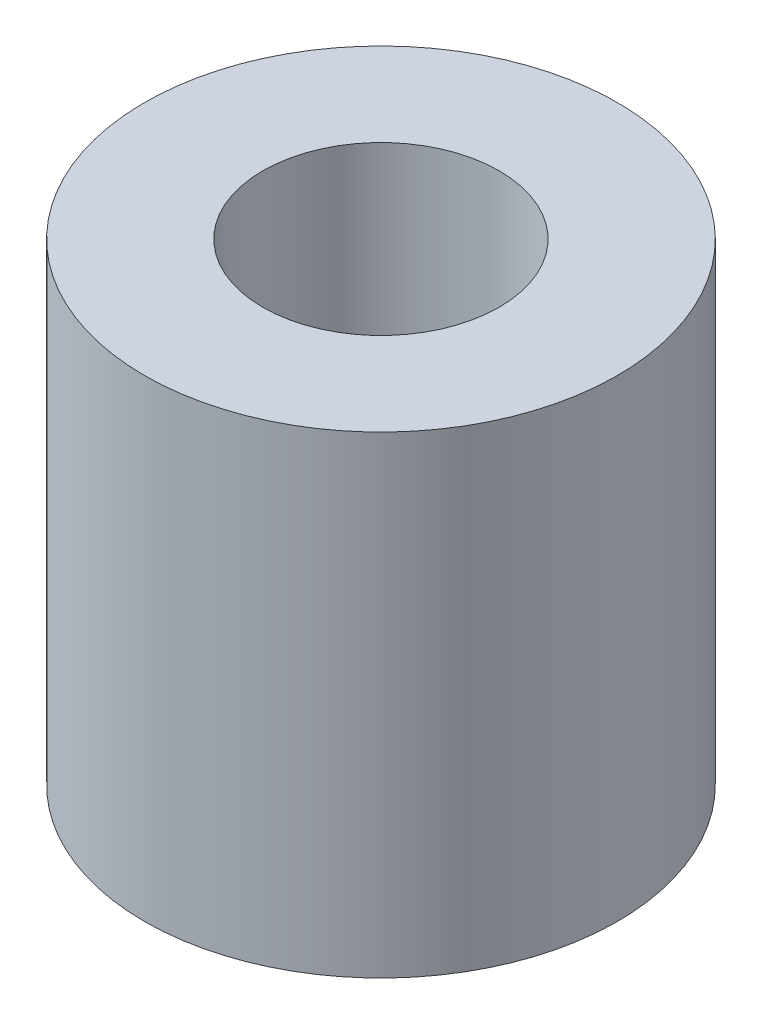
ISO-10303-21;
HEADER;
FILE_DESCRIPTION(('STEP AP214'),'2;1');
FILE_NAME('part.step','',(''),(''),'','','');
FILE_SCHEMA(('AUTOMOTIVE_DESIGN { 1 0 10303 214 1 1 1 1 }'));
ENDSEC;
DATA;
#1=APPLICATION_CONTEXT('core data for automotive mechanical design processes');
#2=APPLICATION_PROTOCOL_DEFINITION('international standard','automotive_design',2000,#1);
#3=PRODUCT_CONTEXT('',#1,'mechanical');
#4=PRODUCT('Part','Part','',(#3));
#5=PRODUCT_RELATED_PRODUCT_CATEGORY('part','',(#4));
#6=PRODUCT_DEFINITION_FORMATION('','',#4);
#7=PRODUCT_DEFINITION_CONTEXT('part definition',#1,'design');
#8=PRODUCT_DEFINITION('design','',#6,#7);
#9=PRODUCT_DEFINITION_SHAPE('','',#8);
#10=(LENGTH_UNIT() NAMED_UNIT(*) SI_UNIT(.MILLI.,.METRE.));
#11=(NAMED_UNIT(*) PLANE_ANGLE_UNIT() SI_UNIT($,.RADIAN.));
#12=(NAMED_UNIT(*) SI_UNIT($,.STERADIAN.) SOLID_ANGLE_UNIT());
#13=UNCERTAINTY_MEASURE_WITH_UNIT(LENGTH_MEASURE(1.E-05),#10,'distance_accuracy_value','');
#14=(GEOMETRIC_REPRESENTATION_CONTEXT(3) GLOBAL_UNCERTAINTY_ASSIGNED_CONTEXT((#13)) GLOBAL_UNIT_ASSIGNED_CONTEXT((#10,
#11,#12)) REPRESENTATION_CONTEXT('',''));
#15=CARTESIAN_POINT('',(0.,0.,0.));
#16=DIRECTION('',(0.,0.,1.));
#17=DIRECTION('',(1.,0.,0.));
#18=AXIS2_PLACEMENT_3D('',#15,#16,#17);
#19=CARTESIAN_POINT('',(0.,12.7,0.));
#20=DIRECTION('',(0.,1.,0.));
#21=DIRECTION('',(0.,0.,1.));
#22=AXIS2_PLACEMENT_3D('',#19,#20,#21);
#23=PLANE('',#22);
#24=CARTESIAN_POINT('',(0.,12.7,0.));
#25=DIRECTION('',(0.,1.,0.));
#26=DIRECTION('',(0.,0.,1.));
#27=AXIS2_PLACEMENT_3D('',#24,#25,#26);
#28=CIRCLE('',#27,6.34999999999999);
#29=CARTESIAN_POINT('',(0.,12.7,6.34999999999999));
#30=VERTEX_POINT('',#29);
#31=EDGE_CURVE('E10',#30,#30,#28,.T.);
#32=ORIENTED_EDGE('',*,*,#31,.T.);
#33=EDGE_LOOP('',(#32));
#34=FACE_BOUND('',#33,.T.);
#35=CARTESIAN_POINT('',(0.,12.7,0.));
#36=DIRECTION('',(0.,1.,0.));
#37=DIRECTION('',(0.,0.,1.));
#38=AXIS2_PLACEMENT_3D('',#35,#36,#37);
#39=CIRCLE('',#38,3.175);
#40=CARTESIAN_POINT('',(0.,12.7,3.175));
#41=VERTEX_POINT('',#40);
#42=EDGE_CURVE('E56',#41,#41,#39,.T.);
#43=ORIENTED_EDGE('',*,*,#42,.F.);
#44=EDGE_LOOP('',(#43));
#45=FACE_BOUND('',#44,.T.);
#46=ADVANCED_FACE('F43',(#34,#45),#23,.T.);
#47=CARTESIAN_POINT('',(0.,0.,0.));
#48=DIRECTION('',(0.,1.,0.));
#49=DIRECTION('',(0.,0.,1.));
#50=AXIS2_PLACEMENT_3D('',#47,#48,#49);
#51=PLANE('',#50);
#52=CARTESIAN_POINT('',(0.,0.,0.));
#53=DIRECTION('',(0.,1.,0.));
#54=DIRECTION('',(0.,0.,1.));
#55=AXIS2_PLACEMENT_3D('',#52,#53,#54);
#56=CIRCLE('',#55,6.34999999999999);
#57=CARTESIAN_POINT('',(0.,0.,6.34999999999999));
#58=VERTEX_POINT('',#57);
#59=EDGE_CURVE('E47',#58,#58,#56,.T.);
#60=ORIENTED_EDGE('',*,*,#59,.F.);
#61=EDGE_LOOP('',(#60));
#62=FACE_BOUND('',#61,.T.);
#63=CARTESIAN_POINT('',(0.,0.,0.));
#64=DIRECTION('',(0.,1.,0.));
#65=DIRECTION('',(0.,0.,1.));
#66=AXIS2_PLACEMENT_3D('',#63,#64,#65);
#67=CIRCLE('',#66,3.175);
#68=CARTESIAN_POINT('',(0.,0.,3.175));
#69=VERTEX_POINT('',#68);
#70=EDGE_CURVE('E58',#69,#69,#67,.T.);
#71=ORIENTED_EDGE('',*,*,#70,.T.);
#72=EDGE_LOOP('',(#71));
#73=FACE_BOUND('',#72,.T.);
#74=ADVANCED_FACE('F70',(#62,#73),#51,.F.);
#75=CARTESIAN_POINT('',(0.,12.7,0.));
#76=DIRECTION('',(0.,-1.,0.));
#77=DIRECTION('',(0.,0.,-1.));
#78=AXIS2_PLACEMENT_3D('',#75,#76,#77);
#79=CYLINDRICAL_SURFACE('',#78,6.34999999999999);
#80=ORIENTED_EDGE('',*,*,#31,.F.);
#81=EDGE_LOOP('',(#80));
#82=FACE_BOUND('',#81,.T.);
#83=ORIENTED_EDGE('',*,*,#59,.T.);
#84=EDGE_LOOP('',(#83));
#85=FACE_BOUND('',#84,.T.);
#86=ADVANCED_FACE('F45',(#82,#85),#79,.T.);
#87=CARTESIAN_POINT('',(0.,12.7,0.));
#88=DIRECTION('',(0.,-1.,0.));
#89=DIRECTION('',(0.,0.,-1.));
#90=AXIS2_PLACEMENT_3D('',#87,#88,#89);
#91=CYLINDRICAL_SURFACE('',#90,3.175);
#92=ORIENTED_EDGE('',*,*,#42,.T.);
#93=EDGE_LOOP('',(#92));
#94=FACE_BOUND('',#93,.T.);
#95=ORIENTED_EDGE('',*,*,#70,.F.);
#96=EDGE_LOOP('',(#95));
#97=FACE_BOUND('',#96,.T.);
#98=ADVANCED_FACE('F66',(#94,#97),#91,.F.);
#99=CLOSED_SHELL('',(#46,#74,#86,#98));
#100=MANIFOLD_SOLID_BREP('B2',#99);
#101=ADVANCED_BREP_SHAPE_REPRESENTATION('',(#18,#100),#14);
#102=SHAPE_DEFINITION_REPRESENTATION(#9,#101);
ENDSEC;
END-ISO-10303-21;
